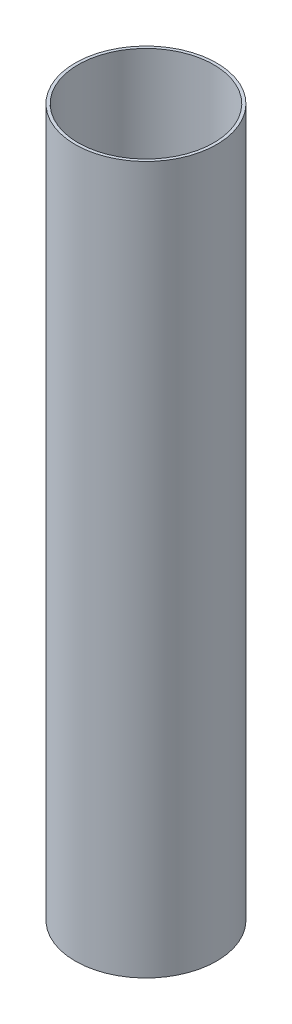
ISO-10303-21;
HEADER;
FILE_DESCRIPTION(('STEP AP214'),'2;1');
FILE_NAME('part.step','',(''),(''),'','','');
FILE_SCHEMA(('AUTOMOTIVE_DESIGN { 1 0 10303 214 1 1 1 1 }'));
ENDSEC;
DATA;
#1=APPLICATION_CONTEXT('core data for automotive mechanical design processes');
#2=APPLICATION_PROTOCOL_DEFINITION('international standard','automotive_design',2000,#1);
#3=PRODUCT_CONTEXT('',#1,'mechanical');
#4=PRODUCT('Part','Part','',(#3));
#5=PRODUCT_RELATED_PRODUCT_CATEGORY('part','',(#4));
#6=PRODUCT_DEFINITION_FORMATION('','',#4);
#7=PRODUCT_DEFINITION_CONTEXT('part definition',#1,'design');
#8=PRODUCT_DEFINITION('design','',#6,#7);
#9=PRODUCT_DEFINITION_SHAPE('','',#8);
#10=(LENGTH_UNIT() NAMED_UNIT(*) SI_UNIT(.MILLI.,.METRE.));
#11=(NAMED_UNIT(*) PLANE_ANGLE_UNIT() SI_UNIT($,.RADIAN.));
#12=(NAMED_UNIT(*) SI_UNIT($,.STERADIAN.) SOLID_ANGLE_UNIT());
#13=UNCERTAINTY_MEASURE_WITH_UNIT(LENGTH_MEASURE(1.E-05),#10,'distance_accuracy_value','');
#14=(GEOMETRIC_REPRESENTATION_CONTEXT(3) GLOBAL_UNCERTAINTY_ASSIGNED_CONTEXT((#13)) GLOBAL_UNIT_ASSIGNED_CONTEXT((#10,
#11,#12)) REPRESENTATION_CONTEXT('',''));
#15=CARTESIAN_POINT('',(0.,0.,0.));
#16=DIRECTION('',(0.,0.,1.));
#17=DIRECTION('',(1.,0.,0.));
#18=AXIS2_PLACEMENT_3D('',#15,#16,#17);
#19=CARTESIAN_POINT('',(0.,762.,0.));
#20=DIRECTION('',(0.,1.,0.));
#21=DIRECTION('',(0.,0.,1.));
#22=AXIS2_PLACEMENT_3D('',#19,#20,#21);
#23=PLANE('',#22);
#24=CARTESIAN_POINT('',(0.,762.,0.));
#25=DIRECTION('',(0.,1.,0.));
#26=DIRECTION('',(0.,0.,1.));
#27=AXIS2_PLACEMENT_3D('',#24,#25,#26);
#28=CIRCLE('',#27,76.2);
#29=CARTESIAN_POINT('',(0.,762.,76.2));
#30=VERTEX_POINT('',#29);
#31=EDGE_CURVE('E10',#30,#30,#28,.T.);
#32=ORIENTED_EDGE('',*,*,#31,.T.);
#33=EDGE_LOOP('',(#32));
#34=FACE_BOUND('',#33,.T.);
#35=CARTESIAN_POINT('',(0.,762.,0.));
#36=DIRECTION('',(0.,1.,0.));
#37=DIRECTION('',(0.,0.,1.));
#38=AXIS2_PLACEMENT_3D('',#35,#36,#37);
#39=CIRCLE('',#38,73.025);
#40=CARTESIAN_POINT('',(0.,762.,73.025));
#41=VERTEX_POINT('',#40);
#42=EDGE_CURVE('E47',#41,#41,#39,.T.);
#43=ORIENTED_EDGE('',*,*,#42,.F.);
#44=EDGE_LOOP('',(#43));
#45=FACE_BOUND('',#44,.T.);
#46=ADVANCED_FACE('F35',(#34,#45),#23,.T.);
#47=CARTESIAN_POINT('',(0.,0.,0.));
#48=DIRECTION('',(0.,1.,0.));
#49=DIRECTION('',(0.,0.,1.));
#50=AXIS2_PLACEMENT_3D('',#47,#48,#49);
#51=PLANE('',#50);
#52=CARTESIAN_POINT('',(0.,0.,0.));
#53=DIRECTION('',(0.,1.,0.));
#54=DIRECTION('',(0.,0.,1.));
#55=AXIS2_PLACEMENT_3D('',#52,#53,#54);
#56=CIRCLE('',#55,76.2);
#57=CARTESIAN_POINT('',(0.,0.,76.2));
#58=VERTEX_POINT('',#57);
#59=EDGE_CURVE('E39',#58,#58,#56,.T.);
#60=ORIENTED_EDGE('',*,*,#59,.F.);
#61=EDGE_LOOP('',(#60));
#62=FACE_BOUND('',#61,.T.);
#63=CARTESIAN_POINT('',(0.,0.,0.));
#64=DIRECTION('',(0.,1.,0.));
#65=DIRECTION('',(0.,0.,1.));
#66=AXIS2_PLACEMENT_3D('',#63,#64,#65);
#67=CIRCLE('',#66,73.025);
#68=CARTESIAN_POINT('',(0.,0.,73.025));
#69=VERTEX_POINT('',#68);
#70=EDGE_CURVE('E49',#69,#69,#67,.T.);
#71=ORIENTED_EDGE('',*,*,#70,.T.);
#72=EDGE_LOOP('',(#71));
#73=FACE_BOUND('',#72,.T.);
#74=ADVANCED_FACE('F60',(#62,#73),#51,.F.);
#75=CARTESIAN_POINT('',(0.,762.,0.));
#76=DIRECTION('',(0.,-1.,0.));
#77=DIRECTION('',(0.,0.,-1.));
#78=AXIS2_PLACEMENT_3D('',#75,#76,#77);
#79=CYLINDRICAL_SURFACE('',#78,76.2);
#80=ORIENTED_EDGE('',*,*,#31,.F.);
#81=EDGE_LOOP('',(#80));
#82=FACE_BOUND('',#81,.T.);
#83=ORIENTED_EDGE('',*,*,#59,.T.);
#84=EDGE_LOOP('',(#83));
#85=FACE_BOUND('',#84,.T.);
#86=ADVANCED_FACE('F37',(#82,#85),#79,.T.);
#87=CARTESIAN_POINT('',(0.,762.,0.));
#88=DIRECTION('',(0.,-1.,0.));
#89=DIRECTION('',(0.,0.,-1.));
#90=AXIS2_PLACEMENT_3D('',#87,#88,#89);
#91=CYLINDRICAL_SURFACE('',#90,73.025);
#92=ORIENTED_EDGE('',*,*,#42,.T.);
#93=EDGE_LOOP('',(#92));
#94=FACE_BOUND('',#93,.T.);
#95=ORIENTED_EDGE('',*,*,#70,.F.);
#96=EDGE_LOOP('',(#95));
#97=FACE_BOUND('',#96,.T.);
#98=ADVANCED_FACE('F56',(#94,#97),#91,.F.);
#99=CLOSED_SHELL('',(#46,#74,#86,#98));
#100=MANIFOLD_SOLID_BREP('B2',#99);
#101=ADVANCED_BREP_SHAPE_REPRESENTATION('',(#18,#100),#14);
#102=SHAPE_DEFINITION_REPRESENTATION(#9,#101);
ENDSEC;
END-ISO-10303-21;
